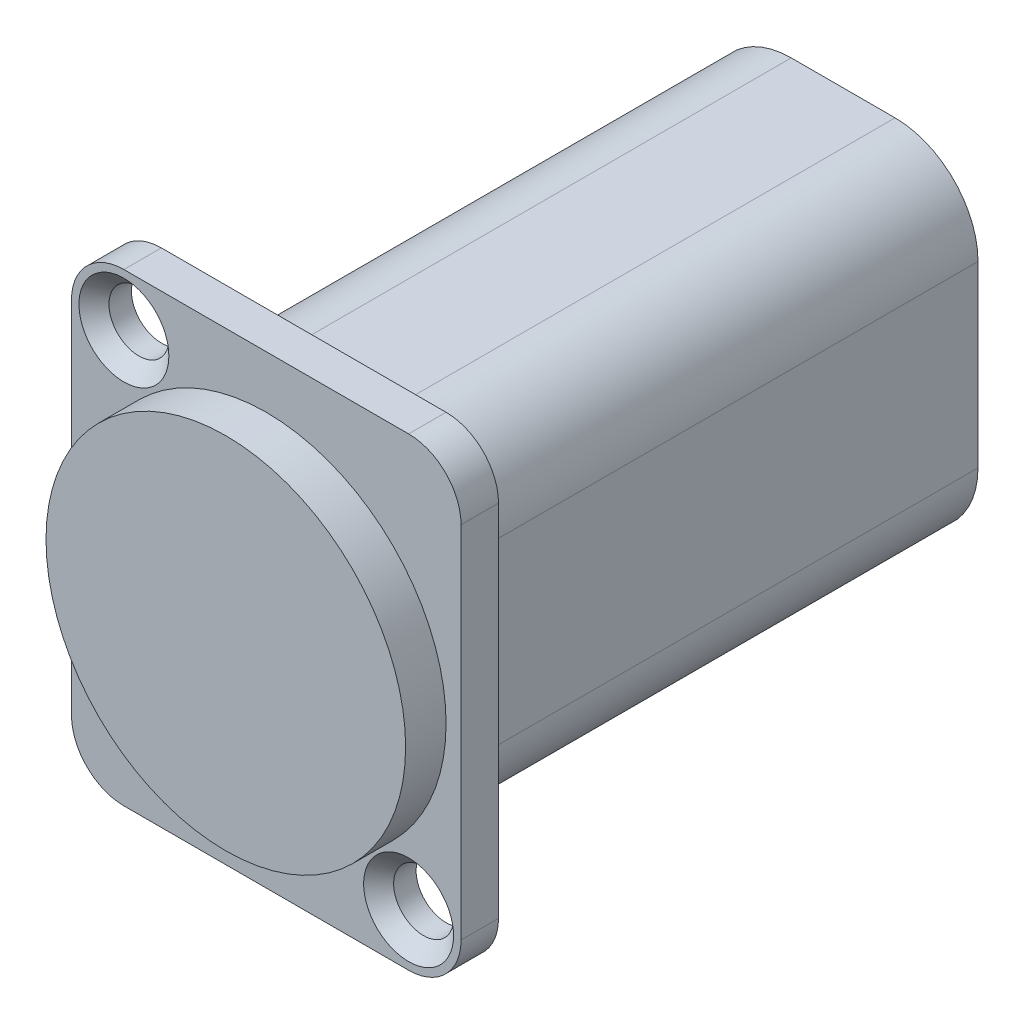
ISO-10303-21;
HEADER;
FILE_DESCRIPTION(('STEP AP214'),'2;1');
FILE_NAME('part.step','',(''),(''),'','','');
FILE_SCHEMA(('AUTOMOTIVE_DESIGN { 1 0 10303 214 1 1 1 1 }'));
ENDSEC;
DATA;
#1=APPLICATION_CONTEXT('core data for automotive mechanical design processes');
#2=APPLICATION_PROTOCOL_DEFINITION('international standard','automotive_design',2000,#1);
#3=PRODUCT_CONTEXT('',#1,'mechanical');
#4=PRODUCT('Part','Part','',(#3));
#5=PRODUCT_RELATED_PRODUCT_CATEGORY('part','',(#4));
#6=PRODUCT_DEFINITION_FORMATION('','',#4);
#7=PRODUCT_DEFINITION_CONTEXT('part definition',#1,'design');
#8=PRODUCT_DEFINITION('design','',#6,#7);
#9=PRODUCT_DEFINITION_SHAPE('','',#8);
#10=(LENGTH_UNIT() NAMED_UNIT(*) SI_UNIT(.MILLI.,.METRE.));
#11=(NAMED_UNIT(*) PLANE_ANGLE_UNIT() SI_UNIT($,.RADIAN.));
#12=(NAMED_UNIT(*) SI_UNIT($,.STERADIAN.) SOLID_ANGLE_UNIT());
#13=UNCERTAINTY_MEASURE_WITH_UNIT(LENGTH_MEASURE(1.E-05),#10,'distance_accuracy_value','');
#14=(GEOMETRIC_REPRESENTATION_CONTEXT(3) GLOBAL_UNCERTAINTY_ASSIGNED_CONTEXT((#13)) GLOBAL_UNIT_ASSIGNED_CONTEXT((#10,
#11,#12)) REPRESENTATION_CONTEXT('',''));
#15=CARTESIAN_POINT('',(0.,0.,0.));
#16=DIRECTION('',(0.,0.,1.));
#17=DIRECTION('',(1.,0.,0.));
#18=AXIS2_PLACEMENT_3D('',#15,#16,#17);
#19=CARTESIAN_POINT('',(-9.5,12.,1.25));
#20=DIRECTION('',(0.,0.,-1.));
#21=DIRECTION('',(-1.,0.,0.));
#22=AXIS2_PLACEMENT_3D('',#19,#20,#21);
#23=CYLINDRICAL_SURFACE('',#22,3.5);
#24=CARTESIAN_POINT('',(-9.5,12.,-1.25));
#25=DIRECTION('',(0.,0.,1.));
#26=DIRECTION('',(1.,0.,0.));
#27=AXIS2_PLACEMENT_3D('',#24,#25,#26);
#28=CIRCLE('',#27,3.5);
#29=CARTESIAN_POINT('',(-13.,12.,-1.25));
#30=VERTEX_POINT('',#29);
#31=CARTESIAN_POINT('',(-9.5,15.5,-1.25));
#32=VERTEX_POINT('',#31);
#33=EDGE_CURVE('E155',#30,#32,#28,.F.);
#34=ORIENTED_EDGE('',*,*,#33,.F.);
#35=DIRECTION('',(0.,0.,-1.));
#36=VECTOR('',#35,1.);
#37=CARTESIAN_POINT('',(-13.,12.,1.25));
#38=LINE('',#37,#36);
#39=CARTESIAN_POINT('',(-13.,12.,1.25));
#40=VERTEX_POINT('',#39);
#41=EDGE_CURVE('E106',#40,#30,#38,.T.);
#42=ORIENTED_EDGE('',*,*,#41,.F.);
#43=CARTESIAN_POINT('',(-9.5,12.,1.25));
#44=DIRECTION('',(0.,0.,1.));
#45=DIRECTION('',(1.,0.,0.));
#46=AXIS2_PLACEMENT_3D('',#43,#44,#45);
#47=CIRCLE('',#46,3.5);
#48=CARTESIAN_POINT('',(-9.5,15.5,1.25));
#49=VERTEX_POINT('',#48);
#50=EDGE_CURVE('E180',#40,#49,#47,.F.);
#51=ORIENTED_EDGE('',*,*,#50,.T.);
#52=DIRECTION('',(0.,0.,-1.));
#53=VECTOR('',#52,1.);
#54=CARTESIAN_POINT('',(-9.5,15.5,1.25));
#55=LINE('',#54,#53);
#56=EDGE_CURVE('E70',#49,#32,#55,.T.);
#57=ORIENTED_EDGE('',*,*,#56,.T.);
#58=EDGE_LOOP('',(#34,#42,#51,#57));
#59=FACE_BOUND('',#58,.T.);
#60=ADVANCED_FACE('F45',(#59),#23,.T.);
#61=CARTESIAN_POINT('',(-13.,0.,1.25));
#62=DIRECTION('',(-1.,0.,0.));
#63=DIRECTION('',(0.,-1.,0.));
#64=AXIS2_PLACEMENT_3D('',#61,#62,#63);
#65=PLANE('',#64);
#66=DIRECTION('',(0.,1.,0.));
#67=VECTOR('',#66,1.);
#68=CARTESIAN_POINT('',(-13.,0.,-1.25));
#69=LINE('',#68,#67);
#70=CARTESIAN_POINT('',(-13.,-12.,-1.25));
#71=VERTEX_POINT('',#70);
#72=EDGE_CURVE('E157',#71,#30,#69,.T.);
#73=ORIENTED_EDGE('',*,*,#72,.F.);
#74=DIRECTION('',(0.,0.,-1.));
#75=VECTOR('',#74,1.);
#76=CARTESIAN_POINT('',(-13.,-12.,1.25));
#77=LINE('',#76,#75);
#78=CARTESIAN_POINT('',(-13.,-12.,1.25));
#79=VERTEX_POINT('',#78);
#80=EDGE_CURVE('E189',#79,#71,#77,.T.);
#81=ORIENTED_EDGE('',*,*,#80,.F.);
#82=DIRECTION('',(0.,1.,0.));
#83=VECTOR('',#82,1.);
#84=CARTESIAN_POINT('',(-13.,0.,1.25));
#85=LINE('',#84,#83);
#86=EDGE_CURVE('E295',#79,#40,#85,.T.);
#87=ORIENTED_EDGE('',*,*,#86,.T.);
#88=ORIENTED_EDGE('',*,*,#41,.T.);
#89=EDGE_LOOP('',(#73,#81,#87,#88));
#90=FACE_BOUND('',#89,.T.);
#91=ADVANCED_FACE('F233',(#90),#65,.T.);
#92=CARTESIAN_POINT('',(-9.5,-12.,1.25));
#93=DIRECTION('',(0.,0.,-1.));
#94=DIRECTION('',(-1.,0.,0.));
#95=AXIS2_PLACEMENT_3D('',#92,#93,#94);
#96=CYLINDRICAL_SURFACE('',#95,3.5);
#97=CARTESIAN_POINT('',(-9.5,-12.,-1.25));
#98=DIRECTION('',(0.,0.,1.));
#99=DIRECTION('',(1.,0.,0.));
#100=AXIS2_PLACEMENT_3D('',#97,#98,#99);
#101=CIRCLE('',#100,3.5);
#102=CARTESIAN_POINT('',(-9.5,-15.5,-1.25));
#103=VERTEX_POINT('',#102);
#104=EDGE_CURVE('E161',#103,#71,#101,.F.);
#105=ORIENTED_EDGE('',*,*,#104,.F.);
#106=DIRECTION('',(0.,0.,-1.));
#107=VECTOR('',#106,1.);
#108=CARTESIAN_POINT('',(-9.5,-15.5,1.25));
#109=LINE('',#108,#107);
#110=CARTESIAN_POINT('',(-9.5,-15.5,1.25));
#111=VERTEX_POINT('',#110);
#112=EDGE_CURVE('E187',#111,#103,#109,.T.);
#113=ORIENTED_EDGE('',*,*,#112,.F.);
#114=CARTESIAN_POINT('',(-9.5,-12.,1.25));
#115=DIRECTION('',(0.,0.,1.));
#116=DIRECTION('',(1.,0.,0.));
#117=AXIS2_PLACEMENT_3D('',#114,#115,#116);
#118=CIRCLE('',#117,3.5);
#119=EDGE_CURVE('E298',#111,#79,#118,.F.);
#120=ORIENTED_EDGE('',*,*,#119,.T.);
#121=ORIENTED_EDGE('',*,*,#80,.T.);
#122=EDGE_LOOP('',(#105,#113,#120,#121));
#123=FACE_BOUND('',#122,.T.);
#124=ADVANCED_FACE('F238',(#123),#96,.T.);
#125=CARTESIAN_POINT('',(0.,-15.5,1.25));
#126=DIRECTION('',(0.,1.,0.));
#127=DIRECTION('',(0.,0.,1.));
#128=AXIS2_PLACEMENT_3D('',#125,#126,#127);
#129=PLANE('',#128);
#130=DIRECTION('',(1.,0.,0.));
#131=VECTOR('',#130,1.);
#132=CARTESIAN_POINT('',(0.,-15.5,-1.25));
#133=LINE('',#132,#131);
#134=CARTESIAN_POINT('',(9.5,-15.5,-1.25));
#135=VERTEX_POINT('',#134);
#136=EDGE_CURVE('E164',#103,#135,#133,.T.);
#137=ORIENTED_EDGE('',*,*,#136,.T.);
#138=DIRECTION('',(0.,0.,-1.));
#139=VECTOR('',#138,1.);
#140=CARTESIAN_POINT('',(9.5,-15.5,1.25));
#141=LINE('',#140,#139);
#142=CARTESIAN_POINT('',(9.5,-15.5,1.25));
#143=VERTEX_POINT('',#142);
#144=EDGE_CURVE('E184',#143,#135,#141,.T.);
#145=ORIENTED_EDGE('',*,*,#144,.F.);
#146=DIRECTION('',(1.,0.,0.));
#147=VECTOR('',#146,1.);
#148=CARTESIAN_POINT('',(0.,-15.5,1.25));
#149=LINE('',#148,#147);
#150=EDGE_CURVE('E301',#111,#143,#149,.T.);
#151=ORIENTED_EDGE('',*,*,#150,.F.);
#152=ORIENTED_EDGE('',*,*,#112,.T.);
#153=EDGE_LOOP('',(#137,#145,#151,#152));
#154=FACE_BOUND('',#153,.T.);
#155=ADVANCED_FACE('F249',(#154),#129,.F.);
#156=CARTESIAN_POINT('',(9.5,-12.,1.25));
#157=DIRECTION('',(0.,0.,-1.));
#158=DIRECTION('',(-1.,0.,0.));
#159=AXIS2_PLACEMENT_3D('',#156,#157,#158);
#160=CYLINDRICAL_SURFACE('',#159,3.5);
#161=CARTESIAN_POINT('',(9.5,-12.,-1.25));
#162=DIRECTION('',(0.,0.,1.));
#163=DIRECTION('',(1.,0.,0.));
#164=AXIS2_PLACEMENT_3D('',#161,#162,#163);
#165=CIRCLE('',#164,3.5);
#166=CARTESIAN_POINT('',(13.,-12.,-1.25));
#167=VERTEX_POINT('',#166);
#168=EDGE_CURVE('E166',#135,#167,#165,.T.);
#169=ORIENTED_EDGE('',*,*,#168,.T.);
#170=DIRECTION('',(0.,0.,-1.));
#171=VECTOR('',#170,1.);
#172=CARTESIAN_POINT('',(13.,-12.,1.25));
#173=LINE('',#172,#171);
#174=CARTESIAN_POINT('',(13.,-12.,1.25));
#175=VERTEX_POINT('',#174);
#176=EDGE_CURVE('E146',#175,#167,#173,.T.);
#177=ORIENTED_EDGE('',*,*,#176,.F.);
#178=CARTESIAN_POINT('',(9.5,-12.,1.25));
#179=DIRECTION('',(0.,0.,1.));
#180=DIRECTION('',(1.,0.,0.));
#181=AXIS2_PLACEMENT_3D('',#178,#179,#180);
#182=CIRCLE('',#181,3.5);
#183=EDGE_CURVE('E133',#143,#175,#182,.T.);
#184=ORIENTED_EDGE('',*,*,#183,.F.);
#185=ORIENTED_EDGE('',*,*,#144,.T.);
#186=EDGE_LOOP('',(#169,#177,#184,#185));
#187=FACE_BOUND('',#186,.T.);
#188=ADVANCED_FACE('F253',(#187),#160,.T.);
#189=CARTESIAN_POINT('',(13.,0.,1.25));
#190=DIRECTION('',(-1.,0.,0.));
#191=DIRECTION('',(0.,0.,1.));
#192=AXIS2_PLACEMENT_3D('',#189,#190,#191);
#193=PLANE('',#192);
#194=DIRECTION('',(0.,1.,0.));
#195=VECTOR('',#194,1.);
#196=CARTESIAN_POINT('',(13.,0.,-1.25));
#197=LINE('',#196,#195);
#198=CARTESIAN_POINT('',(13.,12.,-1.25));
#199=VERTEX_POINT('',#198);
#200=EDGE_CURVE('E142',#167,#199,#197,.T.);
#201=ORIENTED_EDGE('',*,*,#200,.T.);
#202=DIRECTION('',(0.,0.,-1.));
#203=VECTOR('',#202,1.);
#204=CARTESIAN_POINT('',(13.,12.,1.25));
#205=LINE('',#204,#203);
#206=CARTESIAN_POINT('',(13.,12.,1.25));
#207=VERTEX_POINT('',#206);
#208=EDGE_CURVE('E139',#207,#199,#205,.T.);
#209=ORIENTED_EDGE('',*,*,#208,.F.);
#210=DIRECTION('',(0.,1.,0.));
#211=VECTOR('',#210,1.);
#212=CARTESIAN_POINT('',(13.,0.,1.25));
#213=LINE('',#212,#211);
#214=EDGE_CURVE('E125',#175,#207,#213,.T.);
#215=ORIENTED_EDGE('',*,*,#214,.F.);
#216=ORIENTED_EDGE('',*,*,#176,.T.);
#217=EDGE_LOOP('',(#201,#209,#215,#216));
#218=FACE_BOUND('',#217,.T.);
#219=ADVANCED_FACE('F140',(#218),#193,.F.);
#220=CARTESIAN_POINT('',(9.5,12.,1.25));
#221=DIRECTION('',(0.,0.,-1.));
#222=DIRECTION('',(-1.,0.,0.));
#223=AXIS2_PLACEMENT_3D('',#220,#221,#222);
#224=CYLINDRICAL_SURFACE('',#223,3.5);
#225=CARTESIAN_POINT('',(9.5,12.,-1.25));
#226=DIRECTION('',(0.,0.,1.));
#227=DIRECTION('',(1.,0.,0.));
#228=AXIS2_PLACEMENT_3D('',#225,#226,#227);
#229=CIRCLE('',#228,3.5);
#230=CARTESIAN_POINT('',(9.5,15.5,-1.25));
#231=VERTEX_POINT('',#230);
#232=EDGE_CURVE('E169',#199,#231,#229,.T.);
#233=ORIENTED_EDGE('',*,*,#232,.T.);
#234=DIRECTION('',(0.,0.,-1.));
#235=VECTOR('',#234,1.);
#236=CARTESIAN_POINT('',(9.5,15.5,1.25));
#237=LINE('',#236,#235);
#238=CARTESIAN_POINT('',(9.5,15.5,1.25));
#239=VERTEX_POINT('',#238);
#240=EDGE_CURVE('E147',#239,#231,#237,.T.);
#241=ORIENTED_EDGE('',*,*,#240,.F.);
#242=CARTESIAN_POINT('',(9.5,12.,1.25));
#243=DIRECTION('',(0.,0.,1.));
#244=DIRECTION('',(1.,0.,0.));
#245=AXIS2_PLACEMENT_3D('',#242,#243,#244);
#246=CIRCLE('',#245,3.5);
#247=EDGE_CURVE('E130',#207,#239,#246,.T.);
#248=ORIENTED_EDGE('',*,*,#247,.F.);
#249=ORIENTED_EDGE('',*,*,#208,.T.);
#250=EDGE_LOOP('',(#233,#241,#248,#249));
#251=FACE_BOUND('',#250,.T.);
#252=ADVANCED_FACE('F149',(#251),#224,.T.);
#253=CARTESIAN_POINT('',(9.5,-12.,1.25));
#254=DIRECTION('',(0.,0.,-1.));
#255=DIRECTION('',(-1.,0.,0.));
#256=AXIS2_PLACEMENT_3D('',#253,#254,#255);
#257=CYLINDRICAL_SURFACE('',#256,2.);
#258=CARTESIAN_POINT('',(9.5,-12.,0.249999999999997));
#259=DIRECTION('',(0.,0.,1.));
#260=DIRECTION('',(1.,0.,0.));
#261=AXIS2_PLACEMENT_3D('',#258,#259,#260);
#262=CIRCLE('',#261,2.);
#263=CARTESIAN_POINT('',(11.5,-12.,0.249999999999997));
#264=VERTEX_POINT('',#263);
#265=EDGE_CURVE('E11',#264,#264,#262,.T.);
#266=ORIENTED_EDGE('',*,*,#265,.T.);
#267=EDGE_LOOP('',(#266));
#268=FACE_BOUND('',#267,.T.);
#269=CARTESIAN_POINT('',(9.5,-12.,-1.25));
#270=DIRECTION('',(0.,0.,1.));
#271=DIRECTION('',(1.,0.,0.));
#272=AXIS2_PLACEMENT_3D('',#269,#270,#271);
#273=CIRCLE('',#272,2.);
#274=CARTESIAN_POINT('',(11.5,-12.,-1.25));
#275=VERTEX_POINT('',#274);
#276=EDGE_CURVE('E174',#275,#275,#273,.T.);
#277=ORIENTED_EDGE('',*,*,#276,.F.);
#278=EDGE_LOOP('',(#277));
#279=FACE_BOUND('',#278,.T.);
#280=ADVANCED_FACE('F262',(#268,#279),#257,.F.);
#281=CARTESIAN_POINT('',(0.,15.5,1.25));
#282=DIRECTION('',(0.,1.,0.));
#283=DIRECTION('',(-1.,0.,0.));
#284=AXIS2_PLACEMENT_3D('',#281,#282,#283);
#285=PLANE('',#284);
#286=DIRECTION('',(1.,0.,0.));
#287=VECTOR('',#286,1.);
#288=CARTESIAN_POINT('',(0.,15.5,-1.25));
#289=LINE('',#288,#287);
#290=EDGE_CURVE('E171',#32,#231,#289,.T.);
#291=ORIENTED_EDGE('',*,*,#290,.F.);
#292=ORIENTED_EDGE('',*,*,#56,.F.);
#293=DIRECTION('',(1.,0.,0.));
#294=VECTOR('',#293,1.);
#295=CARTESIAN_POINT('',(0.,15.5,1.25));
#296=LINE('',#295,#294);
#297=EDGE_CURVE('E150',#49,#239,#296,.T.);
#298=ORIENTED_EDGE('',*,*,#297,.T.);
#299=ORIENTED_EDGE('',*,*,#240,.T.);
#300=EDGE_LOOP('',(#291,#292,#298,#299));
#301=FACE_BOUND('',#300,.T.);
#302=ADVANCED_FACE('F211',(#301),#285,.T.);
#303=CARTESIAN_POINT('',(-9.5,12.,1.25));
#304=DIRECTION('',(0.,0.,-1.));
#305=DIRECTION('',(-1.,0.,0.));
#306=AXIS2_PLACEMENT_3D('',#303,#304,#305);
#307=CYLINDRICAL_SURFACE('',#306,2.);
#308=CARTESIAN_POINT('',(-9.5,12.,0.250000000000005));
#309=DIRECTION('',(0.,0.,1.));
#310=DIRECTION('',(1.,0.,0.));
#311=AXIS2_PLACEMENT_3D('',#308,#309,#310);
#312=CIRCLE('',#311,2.);
#313=CARTESIAN_POINT('',(-7.5,12.,0.250000000000005));
#314=VERTEX_POINT('',#313);
#315=EDGE_CURVE('E192',#314,#314,#312,.T.);
#316=ORIENTED_EDGE('',*,*,#315,.T.);
#317=EDGE_LOOP('',(#316));
#318=FACE_BOUND('',#317,.T.);
#319=CARTESIAN_POINT('',(-9.5,12.,-1.25));
#320=DIRECTION('',(0.,0.,1.));
#321=DIRECTION('',(1.,0.,0.));
#322=AXIS2_PLACEMENT_3D('',#319,#320,#321);
#323=CIRCLE('',#322,2.);
#324=CARTESIAN_POINT('',(-7.5,12.,-1.25));
#325=VERTEX_POINT('',#324);
#326=EDGE_CURVE('E177',#325,#325,#323,.T.);
#327=ORIENTED_EDGE('',*,*,#326,.F.);
#328=EDGE_LOOP('',(#327));
#329=FACE_BOUND('',#328,.T.);
#330=ADVANCED_FACE('F208',(#318,#329),#307,.F.);
#331=CARTESIAN_POINT('',(0.,0.,1.25));
#332=DIRECTION('',(0.,0.,1.));
#333=DIRECTION('',(1.,0.,0.));
#334=AXIS2_PLACEMENT_3D('',#331,#332,#333);
#335=PLANE('',#334);
#336=CARTESIAN_POINT('',(-9.5,12.,1.25));
#337=DIRECTION('',(0.,0.,1.));
#338=DIRECTION('',(1.,0.,0.));
#339=AXIS2_PLACEMENT_3D('',#336,#337,#338);
#340=CIRCLE('',#339,2.99999999999999);
#341=CARTESIAN_POINT('',(-6.50000000000001,12.,1.25));
#342=VERTEX_POINT('',#341);
#343=EDGE_CURVE('E54',#342,#342,#340,.F.);
#344=ORIENTED_EDGE('',*,*,#343,.T.);
#345=EDGE_LOOP('',(#344));
#346=FACE_BOUND('',#345,.T.);
#347=CARTESIAN_POINT('',(9.5,-12.,1.25));
#348=DIRECTION('',(0.,0.,1.));
#349=DIRECTION('',(1.,0.,0.));
#350=AXIS2_PLACEMENT_3D('',#347,#348,#349);
#351=CIRCLE('',#350,3.);
#352=CARTESIAN_POINT('',(12.5,-12.,1.25));
#353=VERTEX_POINT('',#352);
#354=EDGE_CURVE('E195',#353,#353,#351,.F.);
#355=ORIENTED_EDGE('',*,*,#354,.T.);
#356=EDGE_LOOP('',(#355));
#357=FACE_BOUND('',#356,.T.);
#358=CARTESIAN_POINT('',(0.,0.,1.25));
#359=DIRECTION('',(0.,0.,1.));
#360=DIRECTION('',(1.,0.,0.));
#361=AXIS2_PLACEMENT_3D('',#358,#359,#360);
#362=CIRCLE('',#361,12.);
#363=CARTESIAN_POINT('',(-12.,0.,1.25));
#364=VERTEX_POINT('',#363);
#365=EDGE_CURVE('E283',#364,#364,#362,.T.);
#366=ORIENTED_EDGE('',*,*,#365,.F.);
#367=EDGE_LOOP('',(#366));
#368=FACE_BOUND('',#367,.T.);
#369=ORIENTED_EDGE('',*,*,#50,.F.);
#370=ORIENTED_EDGE('',*,*,#86,.F.);
#371=ORIENTED_EDGE('',*,*,#119,.F.);
#372=ORIENTED_EDGE('',*,*,#150,.T.);
#373=ORIENTED_EDGE('',*,*,#183,.T.);
#374=ORIENTED_EDGE('',*,*,#214,.T.);
#375=ORIENTED_EDGE('',*,*,#247,.T.);
#376=ORIENTED_EDGE('',*,*,#297,.F.);
#377=EDGE_LOOP('',(#369,#370,#371,#372,#373,#374,#375,#376));
#378=FACE_BOUND('',#377,.T.);
#379=ADVANCED_FACE('F127',(#346,#357,#368,#378),#335,.T.);
#380=CARTESIAN_POINT('',(0.,0.,-1.25));
#381=DIRECTION('',(0.,0.,1.));
#382=DIRECTION('',(1.,0.,0.));
#383=AXIS2_PLACEMENT_3D('',#380,#381,#382);
#384=PLANE('',#383);
#385=CARTESIAN_POINT('',(-3.46446609406725,-5.96446609406725,-1.25));
#386=DIRECTION('',(0.,0.,1.));
#387=DIRECTION('',(1.,0.,0.));
#388=AXIS2_PLACEMENT_3D('',#385,#386,#387);
#389=CIRCLE('',#388,5.53553390593275);
#390=CARTESIAN_POINT('',(-9.,-5.96446609406725,-1.25));
#391=VERTEX_POINT('',#390);
#392=CARTESIAN_POINT('',(-3.46446609406726,-11.5,-1.25));
#393=VERTEX_POINT('',#392);
#394=EDGE_CURVE('E329',#391,#393,#389,.T.);
#395=ORIENTED_EDGE('',*,*,#394,.T.);
#396=DIRECTION('',(1.,0.,0.));
#397=VECTOR('',#396,1.);
#398=CARTESIAN_POINT('',(0.,-11.5,-1.25));
#399=LINE('',#398,#397);
#400=CARTESIAN_POINT('',(3.46446609406725,-11.5,-1.25));
#401=VERTEX_POINT('',#400);
#402=EDGE_CURVE('E348',#393,#401,#399,.T.);
#403=ORIENTED_EDGE('',*,*,#402,.T.);
#404=CARTESIAN_POINT('',(3.46446609406725,-5.96446609406725,-1.25));
#405=DIRECTION('',(0.,0.,1.));
#406=DIRECTION('',(1.,0.,0.));
#407=AXIS2_PLACEMENT_3D('',#404,#405,#406);
#408=CIRCLE('',#407,5.53553390593275);
#409=CARTESIAN_POINT('',(9.,-5.96446609406725,-1.25));
#410=VERTEX_POINT('',#409);
#411=EDGE_CURVE('E345',#401,#410,#408,.T.);
#412=ORIENTED_EDGE('',*,*,#411,.T.);
#413=DIRECTION('',(0.,1.,0.));
#414=VECTOR('',#413,1.);
#415=CARTESIAN_POINT('',(9.,0.,-1.25));
#416=LINE('',#415,#414);
#417=CARTESIAN_POINT('',(9.,5.96446609406726,-1.25));
#418=VERTEX_POINT('',#417);
#419=EDGE_CURVE('E61',#410,#418,#416,.T.);
#420=ORIENTED_EDGE('',*,*,#419,.T.);
#421=CARTESIAN_POINT('',(3.46446609406725,5.96446609406726,-1.25));
#422=DIRECTION('',(0.,0.,1.));
#423=DIRECTION('',(1.,0.,0.));
#424=AXIS2_PLACEMENT_3D('',#421,#422,#423);
#425=CIRCLE('',#424,5.53553390593274);
#426=CARTESIAN_POINT('',(3.46446609406725,11.5,-1.25));
#427=VERTEX_POINT('',#426);
#428=EDGE_CURVE('E341',#418,#427,#425,.T.);
#429=ORIENTED_EDGE('',*,*,#428,.T.);
#430=DIRECTION('',(1.,0.,0.));
#431=VECTOR('',#430,1.);
#432=CARTESIAN_POINT('',(0.,11.5,-1.25));
#433=LINE('',#432,#431);
#434=CARTESIAN_POINT('',(-3.46446609406725,11.5,-1.25));
#435=VERTEX_POINT('',#434);
#436=EDGE_CURVE('E338',#435,#427,#433,.T.);
#437=ORIENTED_EDGE('',*,*,#436,.F.);
#438=CARTESIAN_POINT('',(-3.46446609406725,5.96446609406726,-1.25));
#439=DIRECTION('',(0.,0.,1.));
#440=DIRECTION('',(1.,0.,0.));
#441=AXIS2_PLACEMENT_3D('',#438,#439,#440);
#442=CIRCLE('',#441,5.53553390593275);
#443=CARTESIAN_POINT('',(-9.,5.96446609406726,-1.25));
#444=VERTEX_POINT('',#443);
#445=EDGE_CURVE('E335',#435,#444,#442,.T.);
#446=ORIENTED_EDGE('',*,*,#445,.T.);
#447=DIRECTION('',(0.,1.,0.));
#448=VECTOR('',#447,1.);
#449=CARTESIAN_POINT('',(-9.,0.,-1.25));
#450=LINE('',#449,#448);
#451=EDGE_CURVE('E332',#391,#444,#450,.T.);
#452=ORIENTED_EDGE('',*,*,#451,.F.);
#453=EDGE_LOOP('',(#395,#403,#412,#420,#429,#437,#446,#452));
#454=FACE_BOUND('',#453,.T.);
#455=ORIENTED_EDGE('',*,*,#33,.T.);
#456=ORIENTED_EDGE('',*,*,#290,.T.);
#457=ORIENTED_EDGE('',*,*,#232,.F.);
#458=ORIENTED_EDGE('',*,*,#200,.F.);
#459=ORIENTED_EDGE('',*,*,#168,.F.);
#460=ORIENTED_EDGE('',*,*,#136,.F.);
#461=ORIENTED_EDGE('',*,*,#104,.T.);
#462=ORIENTED_EDGE('',*,*,#72,.T.);
#463=EDGE_LOOP('',(#455,#456,#457,#458,#459,#460,#461,#462));
#464=FACE_BOUND('',#463,.T.);
#465=ORIENTED_EDGE('',*,*,#276,.T.);
#466=EDGE_LOOP('',(#465));
#467=FACE_BOUND('',#466,.T.);
#468=ORIENTED_EDGE('',*,*,#326,.T.);
#469=EDGE_LOOP('',(#468));
#470=FACE_BOUND('',#469,.T.);
#471=ADVANCED_FACE('F215',(#454,#464,#467,#470),#384,.F.);
#472=CARTESIAN_POINT('',(0.,0.,3.95));
#473=DIRECTION('',(0.,0.,-1.));
#474=DIRECTION('',(-1.,0.,0.));
#475=AXIS2_PLACEMENT_3D('',#472,#473,#474);
#476=CYLINDRICAL_SURFACE('',#475,12.);
#477=CARTESIAN_POINT('',(0.,0.,3.95));
#478=DIRECTION('',(0.,0.,1.));
#479=DIRECTION('',(1.,0.,0.));
#480=AXIS2_PLACEMENT_3D('',#477,#478,#479);
#481=CIRCLE('',#480,12.);
#482=CARTESIAN_POINT('',(-12.,0.,3.95));
#483=VERTEX_POINT('',#482);
#484=EDGE_CURVE('E158',#483,#483,#481,.T.);
#485=CARTESIAN_POINT('',(-12.,0.,3.95));
#486=CARTESIAN_POINT('',(-12.,0.,3.921875));
#487=CARTESIAN_POINT('',(-12.,0.,3.89375));
#488=CARTESIAN_POINT('',(-12.,0.,3.8375));
#489=CARTESIAN_POINT('',(-12.,0.,3.809375));
#490=CARTESIAN_POINT('',(-12.,0.,3.753125));
#491=CARTESIAN_POINT('',(-12.,0.,3.725));
#492=CARTESIAN_POINT('',(-12.,0.,3.66875));
#493=CARTESIAN_POINT('',(-12.,0.,3.640625));
#494=CARTESIAN_POINT('',(-12.,0.,3.584375));
#495=CARTESIAN_POINT('',(-12.,0.,3.55625));
#496=CARTESIAN_POINT('',(-12.,0.,3.5));
#497=CARTESIAN_POINT('',(-12.,0.,3.471875));
#498=CARTESIAN_POINT('',(-12.,0.,3.415625));
#499=CARTESIAN_POINT('',(-12.,0.,3.3875));
#500=CARTESIAN_POINT('',(-12.,0.,3.33125));
#501=CARTESIAN_POINT('',(-12.,0.,3.303125));
#502=CARTESIAN_POINT('',(-12.,0.,3.246875));
#503=CARTESIAN_POINT('',(-12.,0.,3.21875));
#504=CARTESIAN_POINT('',(-12.,0.,3.1625));
#505=CARTESIAN_POINT('',(-12.,0.,3.134375));
#506=CARTESIAN_POINT('',(-12.,0.,3.078125));
#507=CARTESIAN_POINT('',(-12.,0.,3.05));
#508=CARTESIAN_POINT('',(-12.,0.,2.99375));
#509=CARTESIAN_POINT('',(-12.,0.,2.965625));
#510=CARTESIAN_POINT('',(-12.,0.,2.909375));
#511=CARTESIAN_POINT('',(-12.,0.,2.88125));
#512=CARTESIAN_POINT('',(-12.,0.,2.825));
#513=CARTESIAN_POINT('',(-12.,0.,2.796875));
#514=CARTESIAN_POINT('',(-12.,0.,2.740625));
#515=CARTESIAN_POINT('',(-12.,0.,2.7125));
#516=CARTESIAN_POINT('',(-12.,0.,2.65625));
#517=CARTESIAN_POINT('',(-12.,0.,2.628125));
#518=CARTESIAN_POINT('',(-12.,0.,2.571875));
#519=CARTESIAN_POINT('',(-12.,0.,2.54375));
#520=CARTESIAN_POINT('',(-12.,0.,2.4875));
#521=CARTESIAN_POINT('',(-12.,0.,2.459375));
#522=CARTESIAN_POINT('',(-12.,0.,2.403125));
#523=CARTESIAN_POINT('',(-12.,0.,2.375));
#524=CARTESIAN_POINT('',(-12.,0.,2.31875));
#525=CARTESIAN_POINT('',(-12.,0.,2.290625));
#526=CARTESIAN_POINT('',(-12.,0.,2.234375));
#527=CARTESIAN_POINT('',(-12.,0.,2.20625));
#528=CARTESIAN_POINT('',(-12.,0.,2.15));
#529=CARTESIAN_POINT('',(-12.,0.,2.121875));
#530=CARTESIAN_POINT('',(-12.,0.,2.065625));
#531=CARTESIAN_POINT('',(-12.,0.,2.0375));
#532=CARTESIAN_POINT('',(-12.,0.,1.98125));
#533=CARTESIAN_POINT('',(-12.,0.,1.953125));
#534=CARTESIAN_POINT('',(-12.,0.,1.896875));
#535=CARTESIAN_POINT('',(-12.,0.,1.86875));
#536=CARTESIAN_POINT('',(-12.,0.,1.8125));
#537=CARTESIAN_POINT('',(-12.,0.,1.784375));
#538=CARTESIAN_POINT('',(-12.,0.,1.728125));
#539=CARTESIAN_POINT('',(-12.,0.,1.7));
#540=CARTESIAN_POINT('',(-12.,0.,1.64375));
#541=CARTESIAN_POINT('',(-12.,0.,1.615625));
#542=CARTESIAN_POINT('',(-12.,0.,1.559375));
#543=CARTESIAN_POINT('',(-12.,0.,1.53125));
#544=CARTESIAN_POINT('',(-12.,0.,1.475));
#545=CARTESIAN_POINT('',(-12.,0.,1.446875));
#546=CARTESIAN_POINT('',(-12.,0.,1.390625));
#547=CARTESIAN_POINT('',(-12.,0.,1.3625));
#548=CARTESIAN_POINT('',(-12.,0.,1.30625));
#549=CARTESIAN_POINT('',(-12.,0.,1.278125));
#550=CARTESIAN_POINT('',(-12.,0.,1.25));
#551=B_SPLINE_CURVE_WITH_KNOTS('',3,(#485,#486,#487,#488,#489,#490,#491,#492,#493,#494,#495,
#496,#497,#498,#499,#500,#501,#502,#503,#504,#505,#506,#507,#508,#509,#510,#511,#512,#513,#514,
#515,#516,#517,#518,#519,#520,#521,#522,#523,#524,#525,#526,#527,#528,#529,#530,#531,#532,#533,
#534,#535,#536,#537,#538,#539,#540,#541,#542,#543,#544,#545,#546,#547,#548,#549,#550),
.UNSPECIFIED.,.F.,.F.,(4,2,2,2,2,2,2,2,2,2,2,2,2,2,2,2,2,2,2,2,2,2,2,2,2,2,2,2,2,2,2,2,4),(0.,
0.0843749999999994,0.16875,0.253124999999999,0.3375,0.421875,0.50625,0.590625,0.674999999999999,
0.759375,0.84375,0.928125,1.0125,1.096875,1.18125,1.265625,1.35,1.434375,1.51875,1.603125,
1.6875,1.771875,1.85625,1.940625,2.025,2.109375,2.19375,2.278125,2.3625,2.446875,2.53125,
2.615625,2.7),.UNSPECIFIED.);
#552=EDGE_CURVE('BSEAM217',#483,#364,#551,.T.);
#553=ORIENTED_EDGE('',*,*,#484,.F.);
#554=ORIENTED_EDGE('',*,*,#365,.T.);
#555=ORIENTED_EDGE('',*,*,#552,.T.);
#556=ORIENTED_EDGE('',*,*,#552,.F.);
#557=EDGE_LOOP('',(#553,#555,#554,#556));
#558=FACE_BOUND('',#557,.T.);
#559=ADVANCED_FACE('F217',(#558),#476,.T.);
#560=CARTESIAN_POINT('',(0.,0.,3.95));
#561=DIRECTION('',(0.,0.,1.));
#562=DIRECTION('',(1.,0.,0.));
#563=AXIS2_PLACEMENT_3D('',#560,#561,#562);
#564=PLANE('',#563);
#565=ORIENTED_EDGE('',*,*,#484,.T.);
#566=EDGE_LOOP('',(#565));
#567=FACE_BOUND('',#566,.T.);
#568=ADVANCED_FACE('F225',(#567),#564,.T.);
#569=CARTESIAN_POINT('',(0.,-11.5,-37.25));
#570=DIRECTION('',(0.,-1.,0.));
#571=DIRECTION('',(0.,0.,-1.));
#572=AXIS2_PLACEMENT_3D('',#569,#570,#571);
#573=PLANE('',#572);
#574=ORIENTED_EDGE('',*,*,#402,.F.);
#575=DIRECTION('',(0.,0.,1.));
#576=VECTOR('',#575,1.);
#577=CARTESIAN_POINT('',(-3.46446609406726,-11.5,-37.25));
#578=LINE('',#577,#576);
#579=CARTESIAN_POINT('',(-3.46446609406726,-11.5,-37.25));
#580=VERTEX_POINT('',#579);
#581=EDGE_CURVE('E285',#580,#393,#578,.T.);
#582=ORIENTED_EDGE('',*,*,#581,.F.);
#583=DIRECTION('',(1.,0.,0.));
#584=VECTOR('',#583,1.);
#585=CARTESIAN_POINT('',(0.,-11.5,-37.25));
#586=LINE('',#585,#584);
#587=CARTESIAN_POINT('',(3.46446609406725,-11.5,-37.25));
#588=VERTEX_POINT('',#587);
#589=EDGE_CURVE('E331',#580,#588,#586,.T.);
#590=ORIENTED_EDGE('',*,*,#589,.T.);
#591=DIRECTION('',(0.,0.,1.));
#592=VECTOR('',#591,1.);
#593=CARTESIAN_POINT('',(3.46446609406725,-11.5,-37.25));
#594=LINE('',#593,#592);
#595=EDGE_CURVE('E310',#588,#401,#594,.T.);
#596=ORIENTED_EDGE('',*,*,#595,.T.);
#597=EDGE_LOOP('',(#574,#582,#590,#596));
#598=FACE_BOUND('',#597,.T.);
#599=ADVANCED_FACE('F377',(#598),#573,.T.);
#600=CARTESIAN_POINT('',(-3.46446609406725,-5.96446609406725,-37.25));
#601=DIRECTION('',(0.,0.,1.));
#602=DIRECTION('',(1.,0.,0.));
#603=AXIS2_PLACEMENT_3D('',#600,#601,#602);
#604=CYLINDRICAL_SURFACE('',#603,5.53553390593275);
#605=ORIENTED_EDGE('',*,*,#394,.F.);
#606=DIRECTION('',(0.,0.,1.));
#607=VECTOR('',#606,1.);
#608=CARTESIAN_POINT('',(-9.,-5.96446609406725,-37.25));
#609=LINE('',#608,#607);
#610=CARTESIAN_POINT('',(-9.,-5.96446609406725,-37.25));
#611=VERTEX_POINT('',#610);
#612=EDGE_CURVE('E290',#611,#391,#609,.T.);
#613=ORIENTED_EDGE('',*,*,#612,.F.);
#614=CARTESIAN_POINT('',(-3.46446609406725,-5.96446609406725,-37.25));
#615=DIRECTION('',(0.,0.,1.));
#616=DIRECTION('',(1.,0.,0.));
#617=AXIS2_PLACEMENT_3D('',#614,#615,#616);
#618=CIRCLE('',#617,5.53553390593275);
#619=EDGE_CURVE('E314',#611,#580,#618,.T.);
#620=ORIENTED_EDGE('',*,*,#619,.T.);
#621=ORIENTED_EDGE('',*,*,#581,.T.);
#622=EDGE_LOOP('',(#605,#613,#620,#621));
#623=FACE_BOUND('',#622,.T.);
#624=ADVANCED_FACE('F392',(#623),#604,.T.);
#625=CARTESIAN_POINT('',(-9.,0.,-37.25));
#626=DIRECTION('',(1.,0.,0.));
#627=DIRECTION('',(0.,1.,0.));
#628=AXIS2_PLACEMENT_3D('',#625,#626,#627);
#629=PLANE('',#628);
#630=ORIENTED_EDGE('',*,*,#451,.T.);
#631=DIRECTION('',(0.,0.,1.));
#632=VECTOR('',#631,1.);
#633=CARTESIAN_POINT('',(-9.,5.96446609406726,-37.25));
#634=LINE('',#633,#632);
#635=CARTESIAN_POINT('',(-9.,5.96446609406726,-37.25));
#636=VERTEX_POINT('',#635);
#637=EDGE_CURVE('E324',#636,#444,#634,.T.);
#638=ORIENTED_EDGE('',*,*,#637,.F.);
#639=DIRECTION('',(0.,1.,0.));
#640=VECTOR('',#639,1.);
#641=CARTESIAN_POINT('',(-9.,0.,-37.25));
#642=LINE('',#641,#640);
#643=EDGE_CURVE('E353',#611,#636,#642,.T.);
#644=ORIENTED_EDGE('',*,*,#643,.F.);
#645=ORIENTED_EDGE('',*,*,#612,.T.);
#646=EDGE_LOOP('',(#630,#638,#644,#645));
#647=FACE_BOUND('',#646,.T.);
#648=ADVANCED_FACE('F400',(#647),#629,.F.);
#649=CARTESIAN_POINT('',(-3.46446609406725,5.96446609406726,-37.25));
#650=DIRECTION('',(0.,0.,1.));
#651=DIRECTION('',(1.,0.,0.));
#652=AXIS2_PLACEMENT_3D('',#649,#650,#651);
#653=CYLINDRICAL_SURFACE('',#652,5.53553390593275);
#654=ORIENTED_EDGE('',*,*,#445,.F.);
#655=DIRECTION('',(0.,0.,1.));
#656=VECTOR('',#655,1.);
#657=CARTESIAN_POINT('',(-3.46446609406725,11.5,-37.25));
#658=LINE('',#657,#656);
#659=CARTESIAN_POINT('',(-3.46446609406725,11.5,-37.25));
#660=VERTEX_POINT('',#659);
#661=EDGE_CURVE('E321',#660,#435,#658,.T.);
#662=ORIENTED_EDGE('',*,*,#661,.F.);
#663=CARTESIAN_POINT('',(-3.46446609406725,5.96446609406726,-37.25));
#664=DIRECTION('',(0.,0.,1.));
#665=DIRECTION('',(1.,0.,0.));
#666=AXIS2_PLACEMENT_3D('',#663,#664,#665);
#667=CIRCLE('',#666,5.53553390593275);
#668=EDGE_CURVE('E356',#660,#636,#667,.T.);
#669=ORIENTED_EDGE('',*,*,#668,.T.);
#670=ORIENTED_EDGE('',*,*,#637,.T.);
#671=EDGE_LOOP('',(#654,#662,#669,#670));
#672=FACE_BOUND('',#671,.T.);
#673=ADVANCED_FACE('F419',(#672),#653,.T.);
#674=CARTESIAN_POINT('',(0.,11.5,-37.25));
#675=DIRECTION('',(0.,-1.,0.));
#676=DIRECTION('',(1.,0.,0.));
#677=AXIS2_PLACEMENT_3D('',#674,#675,#676);
#678=PLANE('',#677);
#679=ORIENTED_EDGE('',*,*,#436,.T.);
#680=DIRECTION('',(0.,0.,1.));
#681=VECTOR('',#680,1.);
#682=CARTESIAN_POINT('',(3.46446609406725,11.5,-37.25));
#683=LINE('',#682,#681);
#684=CARTESIAN_POINT('',(3.46446609406725,11.5,-37.25));
#685=VERTEX_POINT('',#684);
#686=EDGE_CURVE('E318',#685,#427,#683,.T.);
#687=ORIENTED_EDGE('',*,*,#686,.F.);
#688=DIRECTION('',(1.,0.,0.));
#689=VECTOR('',#688,1.);
#690=CARTESIAN_POINT('',(0.,11.5,-37.25));
#691=LINE('',#690,#689);
#692=EDGE_CURVE('E359',#660,#685,#691,.T.);
#693=ORIENTED_EDGE('',*,*,#692,.F.);
#694=ORIENTED_EDGE('',*,*,#661,.T.);
#695=EDGE_LOOP('',(#679,#687,#693,#694));
#696=FACE_BOUND('',#695,.T.);
#697=ADVANCED_FACE('F424',(#696),#678,.F.);
#698=CARTESIAN_POINT('',(3.46446609406725,5.96446609406726,-37.25));
#699=DIRECTION('',(0.,0.,1.));
#700=DIRECTION('',(1.,0.,0.));
#701=AXIS2_PLACEMENT_3D('',#698,#699,#700);
#702=CYLINDRICAL_SURFACE('',#701,5.53553390593274);
#703=ORIENTED_EDGE('',*,*,#428,.F.);
#704=DIRECTION('',(0.,0.,1.));
#705=VECTOR('',#704,1.);
#706=CARTESIAN_POINT('',(9.,5.96446609406726,-37.25));
#707=LINE('',#706,#705);
#708=CARTESIAN_POINT('',(9.,5.96446609406726,-37.25));
#709=VERTEX_POINT('',#708);
#710=EDGE_CURVE('E316',#709,#418,#707,.T.);
#711=ORIENTED_EDGE('',*,*,#710,.F.);
#712=CARTESIAN_POINT('',(3.46446609406725,5.96446609406726,-37.25));
#713=DIRECTION('',(0.,0.,1.));
#714=DIRECTION('',(1.,0.,0.));
#715=AXIS2_PLACEMENT_3D('',#712,#713,#714);
#716=CIRCLE('',#715,5.53553390593274);
#717=EDGE_CURVE('E362',#709,#685,#716,.T.);
#718=ORIENTED_EDGE('',*,*,#717,.T.);
#719=ORIENTED_EDGE('',*,*,#686,.T.);
#720=EDGE_LOOP('',(#703,#711,#718,#719));
#721=FACE_BOUND('',#720,.T.);
#722=ADVANCED_FACE('F440',(#721),#702,.T.);
#723=CARTESIAN_POINT('',(9.,0.,-37.25));
#724=DIRECTION('',(1.,0.,0.));
#725=DIRECTION('',(0.,0.,-1.));
#726=AXIS2_PLACEMENT_3D('',#723,#724,#725);
#727=PLANE('',#726);
#728=ORIENTED_EDGE('',*,*,#419,.F.);
#729=DIRECTION('',(0.,0.,1.));
#730=VECTOR('',#729,1.);
#731=CARTESIAN_POINT('',(9.,-5.96446609406725,-37.25));
#732=LINE('',#731,#730);
#733=CARTESIAN_POINT('',(9.,-5.96446609406725,-37.25));
#734=VERTEX_POINT('',#733);
#735=EDGE_CURVE('E313',#734,#410,#732,.T.);
#736=ORIENTED_EDGE('',*,*,#735,.F.);
#737=DIRECTION('',(0.,1.,0.));
#738=VECTOR('',#737,1.);
#739=CARTESIAN_POINT('',(9.,0.,-37.25));
#740=LINE('',#739,#738);
#741=EDGE_CURVE('E365',#734,#709,#740,.T.);
#742=ORIENTED_EDGE('',*,*,#741,.T.);
#743=ORIENTED_EDGE('',*,*,#710,.T.);
#744=EDGE_LOOP('',(#728,#736,#742,#743));
#745=FACE_BOUND('',#744,.T.);
#746=ADVANCED_FACE('F431',(#745),#727,.T.);
#747=CARTESIAN_POINT('',(3.46446609406725,-5.96446609406725,-37.25));
#748=DIRECTION('',(0.,0.,1.));
#749=DIRECTION('',(1.,0.,0.));
#750=AXIS2_PLACEMENT_3D('',#747,#748,#749);
#751=CYLINDRICAL_SURFACE('',#750,5.53553390593275);
#752=ORIENTED_EDGE('',*,*,#411,.F.);
#753=ORIENTED_EDGE('',*,*,#595,.F.);
#754=CARTESIAN_POINT('',(3.46446609406725,-5.96446609406725,-37.25));
#755=DIRECTION('',(0.,0.,1.));
#756=DIRECTION('',(1.,0.,0.));
#757=AXIS2_PLACEMENT_3D('',#754,#755,#756);
#758=CIRCLE('',#757,5.53553390593275);
#759=EDGE_CURVE('E368',#588,#734,#758,.T.);
#760=ORIENTED_EDGE('',*,*,#759,.T.);
#761=ORIENTED_EDGE('',*,*,#735,.T.);
#762=EDGE_LOOP('',(#752,#753,#760,#761));
#763=FACE_BOUND('',#762,.T.);
#764=ADVANCED_FACE('F433',(#763),#751,.T.);
#765=CARTESIAN_POINT('',(3.46446609406725,-5.96446609406725,-37.25));
#766=DIRECTION('',(0.,0.,1.));
#767=DIRECTION('',(1.,0.,0.));
#768=AXIS2_PLACEMENT_3D('',#765,#766,#767);
#769=PLANE('',#768);
#770=ORIENTED_EDGE('',*,*,#589,.F.);
#771=ORIENTED_EDGE('',*,*,#619,.F.);
#772=ORIENTED_EDGE('',*,*,#643,.T.);
#773=ORIENTED_EDGE('',*,*,#668,.F.);
#774=ORIENTED_EDGE('',*,*,#692,.T.);
#775=ORIENTED_EDGE('',*,*,#717,.F.);
#776=ORIENTED_EDGE('',*,*,#741,.F.);
#777=ORIENTED_EDGE('',*,*,#759,.F.);
#778=EDGE_LOOP('',(#770,#771,#772,#773,#774,#775,#776,#777));
#779=FACE_BOUND('',#778,.T.);
#780=ADVANCED_FACE('F205',(#779),#769,.F.);
#781=CARTESIAN_POINT('',(-9.5,12.,0.250000000000005));
#782=DIRECTION('',(0.,0.,1.));
#783=DIRECTION('',(1.,0.,0.));
#784=AXIS2_PLACEMENT_3D('',#781,#782,#783);
#785=CONICAL_SURFACE('',#784,2.,0.785398163397445);
#786=ORIENTED_EDGE('',*,*,#343,.F.);
#787=EDGE_LOOP('',(#786));
#788=FACE_BOUND('',#787,.T.);
#789=ORIENTED_EDGE('',*,*,#315,.F.);
#790=EDGE_LOOP('',(#789));
#791=FACE_BOUND('',#790,.T.);
#792=ADVANCED_FACE('F202',(#788,#791),#785,.F.);
#793=CARTESIAN_POINT('',(9.5,-12.,0.249999999999997));
#794=DIRECTION('',(0.,0.,1.));
#795=DIRECTION('',(1.,0.,0.));
#796=AXIS2_PLACEMENT_3D('',#793,#794,#795);
#797=CONICAL_SURFACE('',#796,2.,0.785398163397448);
#798=ORIENTED_EDGE('',*,*,#354,.F.);
#799=EDGE_LOOP('',(#798));
#800=FACE_BOUND('',#799,.T.);
#801=ORIENTED_EDGE('',*,*,#265,.F.);
#802=EDGE_LOOP('',(#801));
#803=FACE_BOUND('',#802,.T.);
#804=ADVANCED_FACE('F48',(#800,#803),#797,.F.);
#805=CLOSED_SHELL('',(#60,#91,#124,#155,#188,#219,#252,#280,#302,#330,#379,#471,#559,#568,#599,
#624,#648,#673,#697,#722,#746,#764,#780,#792,#804));
#806=MANIFOLD_SOLID_BREP('B2',#805);
#807=ADVANCED_BREP_SHAPE_REPRESENTATION('',(#18,#806),#14);
#808=SHAPE_DEFINITION_REPRESENTATION(#9,#807);
ENDSEC;
END-ISO-10303-21;
